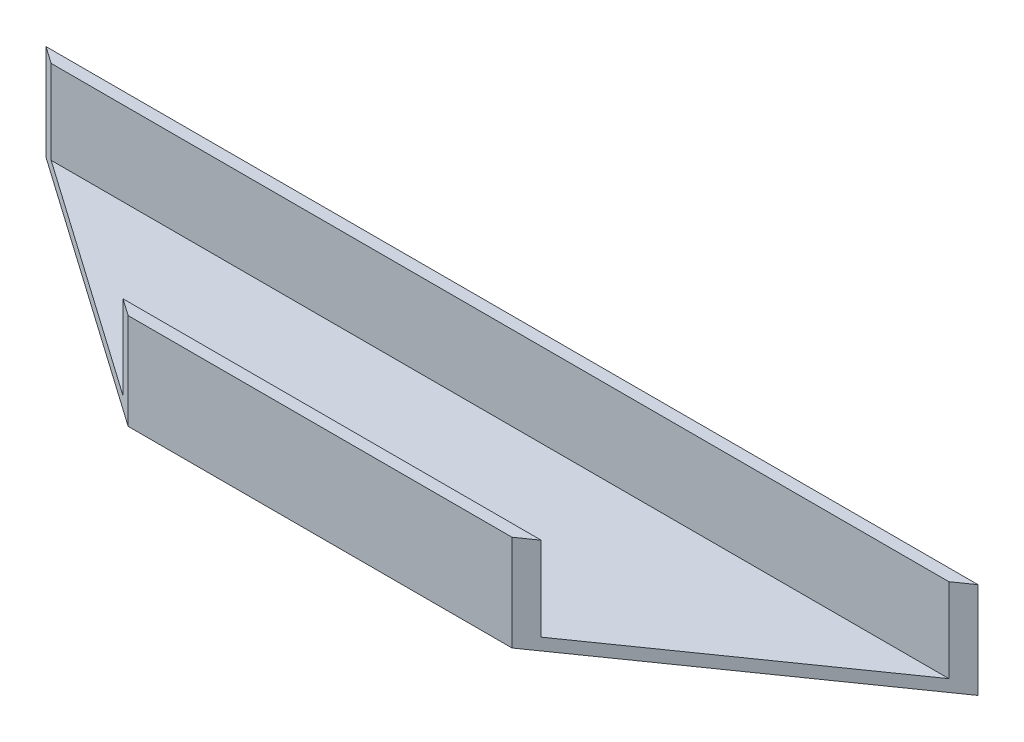
ISO-10303-21;
HEADER;
FILE_DESCRIPTION(('STEP AP214'),'2;1');
FILE_NAME('part.step','',(''),(''),'','','');
FILE_SCHEMA(('AUTOMOTIVE_DESIGN { 1 0 10303 214 1 1 1 1 }'));
ENDSEC;
DATA;
#1=APPLICATION_CONTEXT('core data for automotive mechanical design processes');
#2=APPLICATION_PROTOCOL_DEFINITION('international standard','automotive_design',2000,#1);
#3=PRODUCT_CONTEXT('',#1,'mechanical');
#4=PRODUCT('Part','Part','',(#3));
#5=PRODUCT_RELATED_PRODUCT_CATEGORY('part','',(#4));
#6=PRODUCT_DEFINITION_FORMATION('','',#4);
#7=PRODUCT_DEFINITION_CONTEXT('part definition',#1,'design');
#8=PRODUCT_DEFINITION('design','',#6,#7);
#9=PRODUCT_DEFINITION_SHAPE('','',#8);
#10=(LENGTH_UNIT() NAMED_UNIT(*) SI_UNIT(.MILLI.,.METRE.));
#11=(NAMED_UNIT(*) PLANE_ANGLE_UNIT() SI_UNIT($,.RADIAN.));
#12=(NAMED_UNIT(*) SI_UNIT($,.STERADIAN.) SOLID_ANGLE_UNIT());
#13=UNCERTAINTY_MEASURE_WITH_UNIT(LENGTH_MEASURE(1.E-05),#10,'distance_accuracy_value','');
#14=(GEOMETRIC_REPRESENTATION_CONTEXT(3) GLOBAL_UNCERTAINTY_ASSIGNED_CONTEXT((#13)) GLOBAL_UNIT_ASSIGNED_CONTEXT((#10,
#11,#12)) REPRESENTATION_CONTEXT('',''));
#15=CARTESIAN_POINT('',(0.,0.,0.));
#16=DIRECTION('',(0.,0.,1.));
#17=DIRECTION('',(1.,0.,0.));
#18=AXIS2_PLACEMENT_3D('',#15,#16,#17);
#19=CARTESIAN_POINT('',(406.4,-9.525,22.225));
#20=DIRECTION('',(0.,-1.,0.));
#21=DIRECTION('',(0.,0.,-1.));
#22=AXIS2_PLACEMENT_3D('',#19,#20,#21);
#23=PLANE('',#22);
#24=DIRECTION('',(-1.,0.,0.));
#25=VECTOR('',#24,1.);
#26=CARTESIAN_POINT('',(406.4,-9.525,22.225));
#27=LINE('',#26,#25);
#28=CARTESIAN_POINT('',(258.534369921406,-9.525,22.225));
#29=VERTEX_POINT('',#28);
#30=CARTESIAN_POINT('',(147.865630078594,-9.525,22.225));
#31=VERTEX_POINT('',#30);
#32=EDGE_CURVE('E139',#29,#31,#27,.T.);
#33=ORIENTED_EDGE('',*,*,#32,.F.);
#34=DIRECTION('',(0.819152044288991,0.,-0.573576436351047));
#35=VECTOR('',#34,1.);
#36=CARTESIAN_POINT('',(357.753696956913,-9.525,-47.2491207263568));
#37=LINE('',#36,#35);
#38=CARTESIAN_POINT('',(322.015548821093,-9.525,-22.225));
#39=VERTEX_POINT('',#38);
#40=EDGE_CURVE('E156',#29,#39,#37,.T.);
#41=ORIENTED_EDGE('',*,*,#40,.T.);
#42=DIRECTION('',(-1.,0.,0.));
#43=VECTOR('',#42,1.);
#44=CARTESIAN_POINT('',(406.4,-9.525,-22.225));
#45=LINE('',#44,#43);
#46=CARTESIAN_POINT('',(84.384451178907,-9.525,-22.225));
#47=VERTEX_POINT('',#46);
#48=EDGE_CURVE('E149',#39,#47,#45,.T.);
#49=ORIENTED_EDGE('',*,*,#48,.T.);
#50=DIRECTION('',(0.819152044288991,0.,0.573576436351047));
#51=VECTOR('',#50,1.);
#52=CARTESIAN_POINT('',(321.344796166862,-9.525,143.69641981734));
#53=LINE('',#52,#51);
#54=EDGE_CURVE('E59',#47,#31,#53,.T.);
#55=ORIENTED_EDGE('',*,*,#54,.T.);
#56=EDGE_LOOP('',(#33,#41,#49,#55));
#57=FACE_BOUND('',#56,.T.);
#58=ADVANCED_FACE('F36',(#57),#23,.F.);
#59=CARTESIAN_POINT('',(406.4,-9.525,22.225));
#60=DIRECTION('',(0.,0.,1.));
#61=DIRECTION('',(1.,0.,0.));
#62=AXIS2_PLACEMENT_3D('',#59,#60,#61);
#63=PLANE('',#62);
#64=DIRECTION('',(-1.,0.,0.));
#65=VECTOR('',#64,1.);
#66=CARTESIAN_POINT('',(406.4,12.7,22.225));
#67=LINE('',#66,#65);
#68=CARTESIAN_POINT('',(258.534369921406,12.7,22.225));
#69=VERTEX_POINT('',#68);
#70=CARTESIAN_POINT('',(147.865630078594,12.7,22.225));
#71=VERTEX_POINT('',#70);
#72=EDGE_CURVE('E129',#69,#71,#67,.T.);
#73=ORIENTED_EDGE('',*,*,#72,.F.);
#74=DIRECTION('',(0.,-1.,0.));
#75=VECTOR('',#74,1.);
#76=CARTESIAN_POINT('',(258.534369921406,-9.525,22.225));
#77=LINE('',#76,#75);
#78=EDGE_CURVE('E158',#69,#29,#77,.T.);
#79=ORIENTED_EDGE('',*,*,#78,.T.);
#80=ORIENTED_EDGE('',*,*,#32,.T.);
#81=DIRECTION('',(0.,1.,0.));
#82=VECTOR('',#81,1.);
#83=CARTESIAN_POINT('',(147.865630078594,-9.525,22.225));
#84=LINE('',#83,#82);
#85=EDGE_CURVE('E182',#31,#71,#84,.T.);
#86=ORIENTED_EDGE('',*,*,#85,.T.);
#87=EDGE_LOOP('',(#73,#79,#80,#86));
#88=FACE_BOUND('',#87,.T.);
#89=ADVANCED_FACE('F186',(#88),#63,.F.);
#90=CARTESIAN_POINT('',(406.4,12.7,25.4));
#91=DIRECTION('',(0.,-1.,0.));
#92=DIRECTION('',(0.,0.,-1.));
#93=AXIS2_PLACEMENT_3D('',#90,#91,#92);
#94=PLANE('',#93);
#95=DIRECTION('',(-1.,0.,0.));
#96=VECTOR('',#95,1.);
#97=CARTESIAN_POINT('',(406.4,12.7,25.4));
#98=LINE('',#97,#96);
#99=CARTESIAN_POINT('',(254.,12.7,25.3999999999999));
#100=VERTEX_POINT('',#99);
#101=CARTESIAN_POINT('',(152.4,12.7,25.4));
#102=VERTEX_POINT('',#101);
#103=EDGE_CURVE('E122',#100,#102,#98,.T.);
#104=ORIENTED_EDGE('',*,*,#103,.F.);
#105=DIRECTION('',(-0.819152044288991,0.,0.573576436351047));
#106=VECTOR('',#105,1.);
#107=CARTESIAN_POINT('',(254.,12.7,25.3999999999999));
#108=LINE('',#107,#106);
#109=EDGE_CURVE('E191',#69,#100,#108,.T.);
#110=ORIENTED_EDGE('',*,*,#109,.F.);
#111=ORIENTED_EDGE('',*,*,#72,.T.);
#112=DIRECTION('',(-0.819152044288991,0.,-0.573576436351047));
#113=VECTOR('',#112,1.);
#114=CARTESIAN_POINT('',(152.4,12.7,25.4));
#115=LINE('',#114,#113);
#116=EDGE_CURVE('E190',#102,#71,#115,.T.);
#117=ORIENTED_EDGE('',*,*,#116,.F.);
#118=EDGE_LOOP('',(#104,#110,#111,#117));
#119=FACE_BOUND('',#118,.T.);
#120=ADVANCED_FACE('F189',(#119),#94,.F.);
#121=CARTESIAN_POINT('',(406.4,-12.7,25.4));
#122=DIRECTION('',(0.,0.,-1.));
#123=DIRECTION('',(-1.,0.,0.));
#124=AXIS2_PLACEMENT_3D('',#121,#122,#123);
#125=PLANE('',#124);
#126=DIRECTION('',(-1.,0.,0.));
#127=VECTOR('',#126,1.);
#128=CARTESIAN_POINT('',(406.4,-12.7,25.4));
#129=LINE('',#128,#127);
#130=CARTESIAN_POINT('',(254.,-12.7,25.3999999999999));
#131=VERTEX_POINT('',#130);
#132=CARTESIAN_POINT('',(152.4,-12.7,25.4));
#133=VERTEX_POINT('',#132);
#134=EDGE_CURVE('E120',#131,#133,#129,.T.);
#135=ORIENTED_EDGE('',*,*,#134,.F.);
#136=DIRECTION('',(0.,1.,0.));
#137=VECTOR('',#136,1.);
#138=CARTESIAN_POINT('',(254.,-12.7,25.3999999999999));
#139=LINE('',#138,#137);
#140=EDGE_CURVE('E176',#131,#100,#139,.T.);
#141=ORIENTED_EDGE('',*,*,#140,.T.);
#142=ORIENTED_EDGE('',*,*,#103,.T.);
#143=DIRECTION('',(0.,1.,0.));
#144=VECTOR('',#143,1.);
#145=CARTESIAN_POINT('',(152.4,-12.7,25.4));
#146=LINE('',#145,#144);
#147=EDGE_CURVE('E104',#133,#102,#146,.T.);
#148=ORIENTED_EDGE('',*,*,#147,.F.);
#149=EDGE_LOOP('',(#135,#141,#142,#148));
#150=FACE_BOUND('',#149,.T.);
#151=ADVANCED_FACE('F118',(#150),#125,.F.);
#152=CARTESIAN_POINT('',(406.4,-12.7,25.4));
#153=DIRECTION('',(0.,1.,0.));
#154=DIRECTION('',(0.,0.,1.));
#155=AXIS2_PLACEMENT_3D('',#152,#153,#154);
#156=PLANE('',#155);
#157=DIRECTION('',(-1.,0.,0.));
#158=VECTOR('',#157,1.);
#159=CARTESIAN_POINT('',(406.4,-12.7,-25.4));
#160=LINE('',#159,#158);
#161=CARTESIAN_POINT('',(326.549918742499,-12.7,-25.4000000000001));
#162=VERTEX_POINT('',#161);
#163=CARTESIAN_POINT('',(79.8500812575008,-12.7,-25.4));
#164=VERTEX_POINT('',#163);
#165=EDGE_CURVE('E126',#162,#164,#160,.T.);
#166=ORIENTED_EDGE('',*,*,#165,.F.);
#167=DIRECTION('',(-0.819152044288991,0.,0.573576436351047));
#168=VECTOR('',#167,1.);
#169=CARTESIAN_POINT('',(254.,-12.7,25.3999999999999));
#170=LINE('',#169,#168);
#171=EDGE_CURVE('E113',#162,#131,#170,.T.);
#172=ORIENTED_EDGE('',*,*,#171,.T.);
#173=ORIENTED_EDGE('',*,*,#134,.T.);
#174=DIRECTION('',(-0.819152044288991,0.,-0.573576436351047));
#175=VECTOR('',#174,1.);
#176=CARTESIAN_POINT('',(152.4,-12.7,25.4));
#177=LINE('',#176,#175);
#178=EDGE_CURVE('E101',#133,#164,#177,.T.);
#179=ORIENTED_EDGE('',*,*,#178,.T.);
#180=EDGE_LOOP('',(#166,#172,#173,#179));
#181=FACE_BOUND('',#180,.T.);
#182=ADVANCED_FACE('F125',(#181),#156,.F.);
#183=CARTESIAN_POINT('',(406.4,-12.7,-25.4));
#184=DIRECTION('',(0.,0.,1.));
#185=DIRECTION('',(0.,-1.,0.));
#186=AXIS2_PLACEMENT_3D('',#183,#184,#185);
#187=PLANE('',#186);
#188=DIRECTION('',(-1.,0.,0.));
#189=VECTOR('',#188,1.);
#190=CARTESIAN_POINT('',(406.4,12.7,-25.4));
#191=LINE('',#190,#189);
#192=CARTESIAN_POINT('',(326.549918742499,12.7,-25.4000000000001));
#193=VERTEX_POINT('',#192);
#194=CARTESIAN_POINT('',(79.8500812575008,12.7,-25.4));
#195=VERTEX_POINT('',#194);
#196=EDGE_CURVE('E132',#193,#195,#191,.T.);
#197=ORIENTED_EDGE('',*,*,#196,.F.);
#198=DIRECTION('',(0.,1.,0.));
#199=VECTOR('',#198,1.);
#200=CARTESIAN_POINT('',(326.549918742499,-12.7,-25.4000000000001));
#201=LINE('',#200,#199);
#202=EDGE_CURVE('E174',#162,#193,#201,.T.);
#203=ORIENTED_EDGE('',*,*,#202,.F.);
#204=ORIENTED_EDGE('',*,*,#165,.T.);
#205=DIRECTION('',(0.,1.,0.));
#206=VECTOR('',#205,1.);
#207=CARTESIAN_POINT('',(79.8500812575008,-12.7,-25.4));
#208=LINE('',#207,#206);
#209=EDGE_CURVE('E107',#164,#195,#208,.T.);
#210=ORIENTED_EDGE('',*,*,#209,.T.);
#211=EDGE_LOOP('',(#197,#203,#204,#210));
#212=FACE_BOUND('',#211,.T.);
#213=ADVANCED_FACE('F173',(#212),#187,.F.);
#214=CARTESIAN_POINT('',(406.4,12.7,-25.4));
#215=DIRECTION('',(0.,-1.,0.));
#216=DIRECTION('',(0.,0.,-1.));
#217=AXIS2_PLACEMENT_3D('',#214,#215,#216);
#218=PLANE('',#217);
#219=DIRECTION('',(-1.,0.,0.));
#220=VECTOR('',#219,1.);
#221=CARTESIAN_POINT('',(406.4,12.7,-22.225));
#222=LINE('',#221,#220);
#223=CARTESIAN_POINT('',(322.015548821093,12.7,-22.225));
#224=VERTEX_POINT('',#223);
#225=CARTESIAN_POINT('',(84.384451178907,12.7,-22.225));
#226=VERTEX_POINT('',#225);
#227=EDGE_CURVE('E151',#224,#226,#222,.T.);
#228=ORIENTED_EDGE('',*,*,#227,.F.);
#229=EDGE_CURVE('E50',#193,#224,#108,.T.);
#230=ORIENTED_EDGE('',*,*,#229,.F.);
#231=ORIENTED_EDGE('',*,*,#196,.T.);
#232=EDGE_CURVE('E170',#226,#195,#115,.T.);
#233=ORIENTED_EDGE('',*,*,#232,.F.);
#234=EDGE_LOOP('',(#228,#230,#231,#233));
#235=FACE_BOUND('',#234,.T.);
#236=ADVANCED_FACE('F169',(#235),#218,.F.);
#237=CARTESIAN_POINT('',(406.4,-9.525,-22.225));
#238=DIRECTION('',(0.,0.,-1.));
#239=DIRECTION('',(-1.,0.,0.));
#240=AXIS2_PLACEMENT_3D('',#237,#238,#239);
#241=PLANE('',#240);
#242=ORIENTED_EDGE('',*,*,#48,.F.);
#243=DIRECTION('',(0.,1.,0.));
#244=VECTOR('',#243,1.);
#245=CARTESIAN_POINT('',(322.015548821093,-9.525,-22.225));
#246=LINE('',#245,#244);
#247=EDGE_CURVE('E11',#39,#224,#246,.T.);
#248=ORIENTED_EDGE('',*,*,#247,.T.);
#249=ORIENTED_EDGE('',*,*,#227,.T.);
#250=DIRECTION('',(0.,-1.,0.));
#251=VECTOR('',#250,1.);
#252=CARTESIAN_POINT('',(84.384451178907,-9.525,-22.225));
#253=LINE('',#252,#251);
#254=EDGE_CURVE('E43',#226,#47,#253,.T.);
#255=ORIENTED_EDGE('',*,*,#254,.T.);
#256=EDGE_LOOP('',(#242,#248,#249,#255));
#257=FACE_BOUND('',#256,.T.);
#258=ADVANCED_FACE('F148',(#257),#241,.F.);
#259=CARTESIAN_POINT('',(152.4,-12.7,25.4));
#260=DIRECTION('',(0.573576436351047,0.,-0.819152044288991));
#261=DIRECTION('',(-0.819152044288991,0.,-0.573576436351047));
#262=AXIS2_PLACEMENT_3D('',#259,#260,#261);
#263=PLANE('',#262);
#264=ORIENTED_EDGE('',*,*,#54,.F.);
#265=ORIENTED_EDGE('',*,*,#254,.F.);
#266=ORIENTED_EDGE('',*,*,#232,.T.);
#267=ORIENTED_EDGE('',*,*,#209,.F.);
#268=ORIENTED_EDGE('',*,*,#178,.F.);
#269=ORIENTED_EDGE('',*,*,#147,.T.);
#270=ORIENTED_EDGE('',*,*,#116,.T.);
#271=ORIENTED_EDGE('',*,*,#85,.F.);
#272=EDGE_LOOP('',(#264,#265,#266,#267,#268,#269,#270,#271));
#273=FACE_BOUND('',#272,.T.);
#274=ADVANCED_FACE('F103',(#273),#263,.F.);
#275=CARTESIAN_POINT('',(254.,-12.7,25.3999999999999));
#276=DIRECTION('',(-0.573576436351047,0.,-0.819152044288991));
#277=DIRECTION('',(-0.819152044288991,0.,0.573576436351047));
#278=AXIS2_PLACEMENT_3D('',#275,#276,#277);
#279=PLANE('',#278);
#280=ORIENTED_EDGE('',*,*,#109,.T.);
#281=ORIENTED_EDGE('',*,*,#140,.F.);
#282=ORIENTED_EDGE('',*,*,#171,.F.);
#283=ORIENTED_EDGE('',*,*,#202,.T.);
#284=ORIENTED_EDGE('',*,*,#229,.T.);
#285=ORIENTED_EDGE('',*,*,#247,.F.);
#286=ORIENTED_EDGE('',*,*,#40,.F.);
#287=ORIENTED_EDGE('',*,*,#78,.F.);
#288=EDGE_LOOP('',(#280,#281,#282,#283,#284,#285,#286,#287));
#289=FACE_BOUND('',#288,.T.);
#290=ADVANCED_FACE('F195',(#289),#279,.F.);
#291=CLOSED_SHELL('',(#58,#89,#120,#151,#182,#213,#236,#258,#274,#290));
#292=MANIFOLD_SOLID_BREP('B2',#291);
#293=ADVANCED_BREP_SHAPE_REPRESENTATION('',(#18,#292),#14);
#294=SHAPE_DEFINITION_REPRESENTATION(#9,#293);
ENDSEC;
END-ISO-10303-21;
